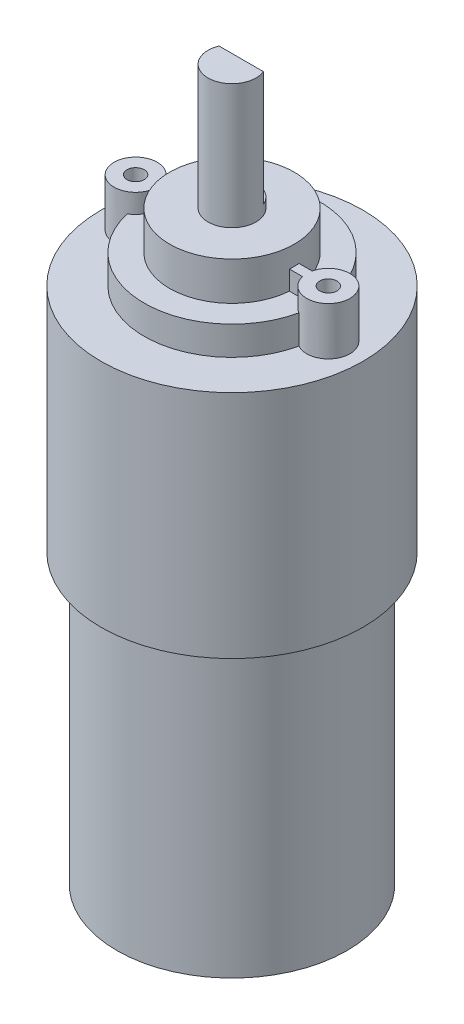
ISO-10303-21;
HEADER;
FILE_DESCRIPTION(('STEP AP214'),'2;1');
FILE_NAME('part.step','',(''),(''),'','','');
FILE_SCHEMA(('AUTOMOTIVE_DESIGN { 1 0 10303 214 1 1 1 1 }'));
ENDSEC;
DATA;
#1=APPLICATION_CONTEXT('core data for automotive mechanical design processes');
#2=APPLICATION_PROTOCOL_DEFINITION('international standard','automotive_design',2000,#1);
#3=PRODUCT_CONTEXT('',#1,'mechanical');
#4=PRODUCT('Part','Part','',(#3));
#5=PRODUCT_RELATED_PRODUCT_CATEGORY('part','',(#4));
#6=PRODUCT_DEFINITION_FORMATION('','',#4);
#7=PRODUCT_DEFINITION_CONTEXT('part definition',#1,'design');
#8=PRODUCT_DEFINITION('design','',#6,#7);
#9=PRODUCT_DEFINITION_SHAPE('','',#8);
#10=(LENGTH_UNIT() NAMED_UNIT(*) SI_UNIT(.MILLI.,.METRE.));
#11=(NAMED_UNIT(*) PLANE_ANGLE_UNIT() SI_UNIT($,.RADIAN.));
#12=(NAMED_UNIT(*) SI_UNIT($,.STERADIAN.) SOLID_ANGLE_UNIT());
#13=UNCERTAINTY_MEASURE_WITH_UNIT(LENGTH_MEASURE(1.E-05),#10,'distance_accuracy_value','');
#14=(GEOMETRIC_REPRESENTATION_CONTEXT(3) GLOBAL_UNCERTAINTY_ASSIGNED_CONTEXT((#13)) GLOBAL_UNIT_ASSIGNED_CONTEXT((#10,
#11,#12)) REPRESENTATION_CONTEXT('',''));
#15=CARTESIAN_POINT('',(0.,0.,0.));
#16=DIRECTION('',(0.,0.,1.));
#17=DIRECTION('',(1.,0.,0.));
#18=AXIS2_PLACEMENT_3D('',#15,#16,#17);
#19=CARTESIAN_POINT('',(0.,26.5,0.));
#20=DIRECTION('',(0.,1.,0.));
#21=DIRECTION('',(0.,0.,1.));
#22=AXIS2_PLACEMENT_3D('',#19,#20,#21);
#23=PLANE('',#22);
#24=DIRECTION('',(1.,0.,0.));
#25=VECTOR('',#24,1.);
#26=CARTESIAN_POINT('',(0.,26.5,0.500000000000004));
#27=LINE('',#26,#25);
#28=CARTESIAN_POINT('',(6.48074069840786,26.5,0.500000000000004));
#29=VERTEX_POINT('',#28);
#30=CARTESIAN_POINT('',(7.84625890315197,26.5,0.500000000000004));
#31=VERTEX_POINT('',#30);
#32=EDGE_CURVE('E167',#29,#31,#27,.T.);
#33=ORIENTED_EDGE('',*,*,#32,.F.);
#34=CARTESIAN_POINT('',(0.,26.5,0.));
#35=DIRECTION('',(0.,1.,0.));
#36=DIRECTION('',(0.,0.,1.));
#37=AXIS2_PLACEMENT_3D('',#34,#35,#36);
#38=CIRCLE('',#37,6.5);
#39=CARTESIAN_POINT('',(-6.48074069840786,26.5,0.500000000000004));
#40=VERTEX_POINT('',#39);
#41=EDGE_CURVE('E284',#40,#29,#38,.T.);
#42=ORIENTED_EDGE('',*,*,#41,.F.);
#43=CARTESIAN_POINT('',(-7.84625890315197,26.5,0.500000000000004));
#44=VERTEX_POINT('',#43);
#45=EDGE_CURVE('E310',#44,#40,#27,.T.);
#46=ORIENTED_EDGE('',*,*,#45,.F.);
#47=CARTESIAN_POINT('',(-10.04,26.5,0.));
#48=DIRECTION('',(0.,1.,0.));
#49=DIRECTION('',(0.,0.,1.));
#50=AXIS2_PLACEMENT_3D('',#47,#48,#49);
#51=CIRCLE('',#50,2.25);
#52=CARTESIAN_POINT('',(-8.93733067729084,26.5,1.96128028714819));
#53=VERTEX_POINT('',#52);
#54=EDGE_CURVE('E223',#44,#53,#51,.F.);
#55=ORIENTED_EDGE('',*,*,#54,.T.);
#56=CARTESIAN_POINT('',(0.,26.5,0.));
#57=DIRECTION('',(0.,1.,0.));
#58=DIRECTION('',(0.,0.,1.));
#59=AXIS2_PLACEMENT_3D('',#56,#57,#58);
#60=CIRCLE('',#59,9.15);
#61=CARTESIAN_POINT('',(8.93733067729083,26.5,1.9612802871482));
#62=VERTEX_POINT('',#61);
#63=EDGE_CURVE('E279',#53,#62,#60,.T.);
#64=ORIENTED_EDGE('',*,*,#63,.T.);
#65=CARTESIAN_POINT('',(10.04,26.5,0.));
#66=DIRECTION('',(0.,1.,0.));
#67=DIRECTION('',(0.,0.,1.));
#68=AXIS2_PLACEMENT_3D('',#65,#66,#67);
#69=CIRCLE('',#68,2.25);
#70=EDGE_CURVE('E238',#31,#62,#69,.T.);
#71=ORIENTED_EDGE('',*,*,#70,.F.);
#72=EDGE_LOOP('',(#33,#42,#46,#55,#64,#71));
#73=FACE_BOUND('',#72,.T.);
#74=ADVANCED_FACE('F40',(#73),#23,.T.);
#75=CARTESIAN_POINT('',(8.93733067729083,26.5,-1.9612802871482));
#76=VERTEX_POINT('',#75);
#77=CARTESIAN_POINT('',(7.84625890315197,26.5,-0.499999999999999));
#78=VERTEX_POINT('',#77);
#79=EDGE_CURVE('E241',#76,#78,#69,.T.);
#80=ORIENTED_EDGE('',*,*,#79,.F.);
#81=CARTESIAN_POINT('',(-8.93733067729083,26.5,-1.9612802871482));
#82=VERTEX_POINT('',#81);
#83=EDGE_CURVE('E332',#76,#82,#60,.T.);
#84=ORIENTED_EDGE('',*,*,#83,.T.);
#85=CARTESIAN_POINT('',(-7.84625890315197,26.5,-0.499999999999999));
#86=VERTEX_POINT('',#85);
#87=EDGE_CURVE('E219',#82,#86,#51,.F.);
#88=ORIENTED_EDGE('',*,*,#87,.T.);
#89=DIRECTION('',(1.,0.,0.));
#90=VECTOR('',#89,1.);
#91=CARTESIAN_POINT('',(0.,26.5,-0.499999999999999));
#92=LINE('',#91,#90);
#93=CARTESIAN_POINT('',(-6.48074069840786,26.5,-0.499999999999999));
#94=VERTEX_POINT('',#93);
#95=EDGE_CURVE('E308',#86,#94,#92,.T.);
#96=ORIENTED_EDGE('',*,*,#95,.T.);
#97=CARTESIAN_POINT('',(6.48074069840786,26.5,-0.499999999999999));
#98=VERTEX_POINT('',#97);
#99=EDGE_CURVE('E286',#98,#94,#38,.T.);
#100=ORIENTED_EDGE('',*,*,#99,.F.);
#101=EDGE_CURVE('E311',#98,#78,#92,.T.);
#102=ORIENTED_EDGE('',*,*,#101,.T.);
#103=EDGE_LOOP('',(#80,#84,#88,#96,#100,#102));
#104=FACE_BOUND('',#103,.T.);
#105=ADVANCED_FACE('F318',(#104),#23,.T.);
#106=CARTESIAN_POINT('',(0.,65.6871565633395,0.));
#107=DIRECTION('',(0.,1.,0.));
#108=DIRECTION('',(0.,0.,1.));
#109=AXIS2_PLACEMENT_3D('',#106,#107,#108);
#110=CYLINDRICAL_SURFACE('',#109,9.15);
#111=DIRECTION('',(0.,-1.,0.));
#112=VECTOR('',#111,1.);
#113=CARTESIAN_POINT('',(8.93733067729083,25.,-1.9612802871482));
#114=LINE('',#113,#112);
#115=CARTESIAN_POINT('',(8.93733067729083,23.5,-1.9612802871482));
#116=VERTEX_POINT('',#115);
#117=EDGE_CURVE('E240',#116,#76,#114,.F.);
#118=ORIENTED_EDGE('',*,*,#117,.F.);
#119=CARTESIAN_POINT('',(0.,23.5,0.));
#120=DIRECTION('',(0.,1.,0.));
#121=DIRECTION('',(0.,0.,1.));
#122=AXIS2_PLACEMENT_3D('',#119,#120,#121);
#123=CIRCLE('',#122,9.15);
#124=CARTESIAN_POINT('',(-8.93733067729083,23.5,-1.9612802871482));
#125=VERTEX_POINT('',#124);
#126=EDGE_CURVE('E339',#116,#125,#123,.T.);
#127=ORIENTED_EDGE('',*,*,#126,.T.);
#128=DIRECTION('',(0.,-1.,0.));
#129=VECTOR('',#128,1.);
#130=CARTESIAN_POINT('',(-8.93733067729083,25.,-1.9612802871482));
#131=LINE('',#130,#129);
#132=EDGE_CURVE('E216',#125,#82,#131,.F.);
#133=ORIENTED_EDGE('',*,*,#132,.T.);
#134=ORIENTED_EDGE('',*,*,#83,.F.);
#135=EDGE_LOOP('',(#118,#127,#133,#134));
#136=FACE_BOUND('',#135,.T.);
#137=ADVANCED_FACE('F338',(#136),#110,.T.);
#138=DIRECTION('',(0.,-1.,0.));
#139=VECTOR('',#138,1.);
#140=CARTESIAN_POINT('',(8.93733067729083,25.,1.9612802871482));
#141=LINE('',#140,#139);
#142=CARTESIAN_POINT('',(8.93733067729083,23.5,1.9612802871482));
#143=VERTEX_POINT('',#142);
#144=EDGE_CURVE('E235',#62,#143,#141,.T.);
#145=ORIENTED_EDGE('',*,*,#144,.F.);
#146=ORIENTED_EDGE('',*,*,#63,.F.);
#147=DIRECTION('',(0.,-1.,0.));
#148=VECTOR('',#147,1.);
#149=CARTESIAN_POINT('',(-8.93733067729083,25.,1.9612802871482));
#150=LINE('',#149,#148);
#151=CARTESIAN_POINT('',(-8.93733067729083,23.5,1.9612802871482));
#152=VERTEX_POINT('',#151);
#153=EDGE_CURVE('E222',#53,#152,#150,.T.);
#154=ORIENTED_EDGE('',*,*,#153,.T.);
#155=EDGE_CURVE('E274',#152,#143,#123,.T.);
#156=ORIENTED_EDGE('',*,*,#155,.T.);
#157=EDGE_LOOP('',(#145,#146,#154,#156));
#158=FACE_BOUND('',#157,.T.);
#159=ADVANCED_FACE('F378',(#158),#110,.T.);
#160=CARTESIAN_POINT('',(0.,23.5,0.));
#161=DIRECTION('',(0.,1.,0.));
#162=DIRECTION('',(0.,0.,1.));
#163=AXIS2_PLACEMENT_3D('',#160,#161,#162);
#164=PLANE('',#163);
#165=CARTESIAN_POINT('',(0.,23.5,0.));
#166=DIRECTION('',(0.,1.,0.));
#167=DIRECTION('',(0.,0.,1.));
#168=AXIS2_PLACEMENT_3D('',#165,#166,#167);
#169=CIRCLE('',#168,13.65);
#170=CARTESIAN_POINT('',(0.,23.5,13.65));
#171=VERTEX_POINT('',#170);
#172=EDGE_CURVE('E271',#171,#171,#169,.T.);
#173=ORIENTED_EDGE('',*,*,#172,.T.);
#174=EDGE_LOOP('',(#173));
#175=FACE_BOUND('',#174,.T.);
#176=CARTESIAN_POINT('',(10.04,23.5,0.));
#177=DIRECTION('',(0.,1.,0.));
#178=DIRECTION('',(0.,0.,1.));
#179=AXIS2_PLACEMENT_3D('',#176,#177,#178);
#180=CIRCLE('',#179,2.25);
#181=EDGE_CURVE('E305',#143,#116,#180,.T.);
#182=ORIENTED_EDGE('',*,*,#181,.F.);
#183=ORIENTED_EDGE('',*,*,#155,.F.);
#184=CARTESIAN_POINT('',(-10.04,23.5,0.));
#185=DIRECTION('',(0.,1.,0.));
#186=DIRECTION('',(0.,0.,1.));
#187=AXIS2_PLACEMENT_3D('',#184,#185,#186);
#188=CIRCLE('',#187,2.25);
#189=EDGE_CURVE('E299',#152,#125,#188,.F.);
#190=ORIENTED_EDGE('',*,*,#189,.T.);
#191=ORIENTED_EDGE('',*,*,#126,.F.);
#192=EDGE_LOOP('',(#182,#183,#190,#191));
#193=FACE_BOUND('',#192,.T.);
#194=ADVANCED_FACE('F367',(#175,#193),#164,.T.);
#195=CARTESIAN_POINT('',(0.,43.5,0.));
#196=DIRECTION('',(0.,1.,0.));
#197=DIRECTION('',(0.,0.,1.));
#198=AXIS2_PLACEMENT_3D('',#195,#196,#197);
#199=PLANE('',#198);
#200=DIRECTION('',(1.,0.,0.));
#201=VECTOR('',#200,1.);
#202=CARTESIAN_POINT('',(0.,43.5,-0.96));
#203=LINE('',#202,#201);
#204=CARTESIAN_POINT('',(-2.30833273164854,43.5,-0.96));
#205=VERTEX_POINT('',#204);
#206=CARTESIAN_POINT('',(2.30833273164854,43.5,-0.96));
#207=VERTEX_POINT('',#206);
#208=EDGE_CURVE('E251',#205,#207,#203,.T.);
#209=ORIENTED_EDGE('',*,*,#208,.F.);
#210=CARTESIAN_POINT('',(0.,43.5,0.));
#211=DIRECTION('',(0.,1.,0.));
#212=DIRECTION('',(0.,0.,1.));
#213=AXIS2_PLACEMENT_3D('',#210,#211,#212);
#214=CIRCLE('',#213,2.5);
#215=EDGE_CURVE('E293',#205,#207,#214,.T.);
#216=ORIENTED_EDGE('',*,*,#215,.T.);
#217=EDGE_LOOP('',(#209,#216));
#218=FACE_BOUND('',#217,.T.);
#219=ADVANCED_FACE('F42',(#218),#199,.T.);
#220=CARTESIAN_POINT('',(0.,65.6871565633395,0.));
#221=DIRECTION('',(0.,1.,0.));
#222=DIRECTION('',(0.,0.,1.));
#223=AXIS2_PLACEMENT_3D('',#220,#221,#222);
#224=CYLINDRICAL_SURFACE('',#223,2.5);
#225=DIRECTION('',(0.,1.,0.));
#226=VECTOR('',#225,1.);
#227=CARTESIAN_POINT('',(2.30833273164854,31.5,-0.96));
#228=LINE('',#227,#226);
#229=CARTESIAN_POINT('',(2.30833273164854,31.5,-0.96));
#230=VERTEX_POINT('',#229);
#231=EDGE_CURVE('E258',#230,#207,#228,.T.);
#232=ORIENTED_EDGE('',*,*,#231,.T.);
#233=ORIENTED_EDGE('',*,*,#215,.F.);
#234=DIRECTION('',(0.,1.,0.));
#235=VECTOR('',#234,1.);
#236=CARTESIAN_POINT('',(-2.30833273164854,31.5,-0.96));
#237=LINE('',#236,#235);
#238=CARTESIAN_POINT('',(-2.30833273164854,31.5,-0.96));
#239=VERTEX_POINT('',#238);
#240=EDGE_CURVE('E256',#239,#205,#237,.T.);
#241=ORIENTED_EDGE('',*,*,#240,.F.);
#242=CARTESIAN_POINT('',(0.,31.5,0.));
#243=DIRECTION('',(0.,1.,0.));
#244=DIRECTION('',(0.,0.,1.));
#245=AXIS2_PLACEMENT_3D('',#242,#243,#244);
#246=CIRCLE('',#245,2.5);
#247=EDGE_CURVE('E252',#230,#239,#246,.T.);
#248=ORIENTED_EDGE('',*,*,#247,.F.);
#249=EDGE_LOOP('',(#232,#233,#241,#248));
#250=FACE_BOUND('',#249,.T.);
#251=CARTESIAN_POINT('',(0.,30.5,0.));
#252=DIRECTION('',(0.,1.,0.));
#253=DIRECTION('',(0.,0.,1.));
#254=AXIS2_PLACEMENT_3D('',#251,#252,#253);
#255=CIRCLE('',#254,2.5);
#256=CARTESIAN_POINT('',(0.,30.5,2.5));
#257=VERTEX_POINT('',#256);
#258=EDGE_CURVE('E290',#257,#257,#255,.T.);
#259=ORIENTED_EDGE('',*,*,#258,.T.);
#260=EDGE_LOOP('',(#259));
#261=FACE_BOUND('',#260,.T.);
#262=ADVANCED_FACE('F574',(#250,#261),#224,.T.);
#263=CARTESIAN_POINT('',(0.,30.5,0.));
#264=DIRECTION('',(0.,1.,0.));
#265=DIRECTION('',(0.,0.,1.));
#266=AXIS2_PLACEMENT_3D('',#263,#264,#265);
#267=PLANE('',#266);
#268=CARTESIAN_POINT('',(0.,30.5,0.));
#269=DIRECTION('',(0.,1.,0.));
#270=DIRECTION('',(0.,0.,1.));
#271=AXIS2_PLACEMENT_3D('',#268,#269,#270);
#272=CIRCLE('',#271,6.5);
#273=CARTESIAN_POINT('',(0.,30.5,6.5));
#274=VERTEX_POINT('',#273);
#275=EDGE_CURVE('E287',#274,#274,#272,.T.);
#276=ORIENTED_EDGE('',*,*,#275,.T.);
#277=EDGE_LOOP('',(#276));
#278=FACE_BOUND('',#277,.T.);
#279=ORIENTED_EDGE('',*,*,#258,.F.);
#280=EDGE_LOOP('',(#279));
#281=FACE_BOUND('',#280,.T.);
#282=ADVANCED_FACE('F518',(#278,#281),#267,.T.);
#283=CARTESIAN_POINT('',(0.,65.6871565633395,0.));
#284=DIRECTION('',(0.,1.,0.));
#285=DIRECTION('',(0.,0.,1.));
#286=AXIS2_PLACEMENT_3D('',#283,#284,#285);
#287=CYLINDRICAL_SURFACE('',#286,6.5);
#288=DIRECTION('',(0.,1.,0.));
#289=VECTOR('',#288,1.);
#290=CARTESIAN_POINT('',(-6.48074069840786,65.6871565633395,0.500000000000004));
#291=LINE('',#290,#289);
#292=CARTESIAN_POINT('',(-6.48074069840786,28.5,0.500000000000004));
#293=VERTEX_POINT('',#292);
#294=EDGE_CURVE('E249',#40,#293,#291,.T.);
#295=ORIENTED_EDGE('',*,*,#294,.F.);
#296=ORIENTED_EDGE('',*,*,#41,.T.);
#297=DIRECTION('',(0.,1.,0.));
#298=VECTOR('',#297,1.);
#299=CARTESIAN_POINT('',(6.48074069840786,65.6871565633395,0.500000000000004));
#300=LINE('',#299,#298);
#301=CARTESIAN_POINT('',(6.48074069840786,28.5,0.500000000000004));
#302=VERTEX_POINT('',#301);
#303=EDGE_CURVE('E55',#302,#29,#300,.F.);
#304=ORIENTED_EDGE('',*,*,#303,.F.);
#305=CARTESIAN_POINT('',(0.,28.5,0.));
#306=DIRECTION('',(0.,1.,0.));
#307=DIRECTION('',(0.,0.,1.));
#308=AXIS2_PLACEMENT_3D('',#305,#306,#307);
#309=CIRCLE('',#308,6.5);
#310=CARTESIAN_POINT('',(6.48074069840786,28.5,-0.499999999999999));
#311=VERTEX_POINT('',#310);
#312=EDGE_CURVE('E44',#311,#302,#309,.F.);
#313=ORIENTED_EDGE('',*,*,#312,.F.);
#314=DIRECTION('',(0.,1.,0.));
#315=VECTOR('',#314,1.);
#316=CARTESIAN_POINT('',(6.48074069840786,65.6871565633395,-0.499999999999999));
#317=LINE('',#316,#315);
#318=EDGE_CURVE('E243',#311,#98,#317,.F.);
#319=ORIENTED_EDGE('',*,*,#318,.T.);
#320=ORIENTED_EDGE('',*,*,#99,.T.);
#321=DIRECTION('',(0.,1.,0.));
#322=VECTOR('',#321,1.);
#323=CARTESIAN_POINT('',(-6.48074069840786,65.6871565633395,-0.499999999999999));
#324=LINE('',#323,#322);
#325=CARTESIAN_POINT('',(-6.48074069840786,28.5,-0.499999999999999));
#326=VERTEX_POINT('',#325);
#327=EDGE_CURVE('E245',#94,#326,#324,.T.);
#328=ORIENTED_EDGE('',*,*,#327,.T.);
#329=EDGE_CURVE('E11',#293,#326,#309,.F.);
#330=ORIENTED_EDGE('',*,*,#329,.F.);
#331=EDGE_LOOP('',(#295,#296,#304,#313,#319,#320,#328,#330));
#332=FACE_BOUND('',#331,.T.);
#333=ORIENTED_EDGE('',*,*,#275,.F.);
#334=EDGE_LOOP('',(#333));
#335=FACE_BOUND('',#334,.T.);
#336=ADVANCED_FACE('F325',(#332,#335),#287,.T.);
#337=CARTESIAN_POINT('',(0.,65.6871565633395,0.));
#338=DIRECTION('',(0.,1.,0.));
#339=DIRECTION('',(0.,0.,1.));
#340=AXIS2_PLACEMENT_3D('',#337,#338,#339);
#341=CYLINDRICAL_SURFACE('',#340,13.65);
#342=CARTESIAN_POINT('',(0.,-0.5,0.));
#343=DIRECTION('',(0.,1.,0.));
#344=DIRECTION('',(0.,0.,1.));
#345=AXIS2_PLACEMENT_3D('',#342,#343,#344);
#346=CIRCLE('',#345,13.65);
#347=CARTESIAN_POINT('',(0.,-0.5,13.65));
#348=VERTEX_POINT('',#347);
#349=EDGE_CURVE('E268',#348,#348,#346,.T.);
#350=ORIENTED_EDGE('',*,*,#349,.T.);
#351=EDGE_LOOP('',(#350));
#352=FACE_BOUND('',#351,.T.);
#353=ORIENTED_EDGE('',*,*,#172,.F.);
#354=EDGE_LOOP('',(#353));
#355=FACE_BOUND('',#354,.T.);
#356=ADVANCED_FACE('F517',(#352,#355),#341,.T.);
#357=CARTESIAN_POINT('',(0.,-0.5,0.));
#358=DIRECTION('',(0.,-1.,0.));
#359=DIRECTION('',(0.,0.,-1.));
#360=AXIS2_PLACEMENT_3D('',#357,#358,#359);
#361=PLANE('',#360);
#362=CARTESIAN_POINT('',(0.,-0.5,0.));
#363=DIRECTION('',(0.,1.,0.));
#364=DIRECTION('',(0.,0.,1.));
#365=AXIS2_PLACEMENT_3D('',#362,#363,#364);
#366=CIRCLE('',#365,12.);
#367=CARTESIAN_POINT('',(0.,-0.5,12.));
#368=VERTEX_POINT('',#367);
#369=EDGE_CURVE('E265',#368,#368,#366,.T.);
#370=ORIENTED_EDGE('',*,*,#369,.T.);
#371=EDGE_LOOP('',(#370));
#372=FACE_BOUND('',#371,.T.);
#373=ORIENTED_EDGE('',*,*,#349,.F.);
#374=EDGE_LOOP('',(#373));
#375=FACE_BOUND('',#374,.T.);
#376=ADVANCED_FACE('F603',(#372,#375),#361,.T.);
#377=CARTESIAN_POINT('',(0.,65.6871565633395,0.));
#378=DIRECTION('',(0.,1.,0.));
#379=DIRECTION('',(0.,0.,1.));
#380=AXIS2_PLACEMENT_3D('',#377,#378,#379);
#381=CYLINDRICAL_SURFACE('',#380,12.);
#382=CARTESIAN_POINT('',(0.,-30.5,0.));
#383=DIRECTION('',(0.,1.,0.));
#384=DIRECTION('',(0.,0.,1.));
#385=AXIS2_PLACEMENT_3D('',#382,#383,#384);
#386=CIRCLE('',#385,12.);
#387=CARTESIAN_POINT('',(0.,-30.5,12.));
#388=VERTEX_POINT('',#387);
#389=EDGE_CURVE('E261',#388,#388,#386,.T.);
#390=ORIENTED_EDGE('',*,*,#389,.T.);
#391=EDGE_LOOP('',(#390));
#392=FACE_BOUND('',#391,.T.);
#393=ORIENTED_EDGE('',*,*,#369,.F.);
#394=EDGE_LOOP('',(#393));
#395=FACE_BOUND('',#394,.T.);
#396=ADVANCED_FACE('F593',(#392,#395),#381,.T.);
#397=CARTESIAN_POINT('',(0.,-30.5,0.));
#398=DIRECTION('',(0.,-1.,0.));
#399=DIRECTION('',(0.,0.,-1.));
#400=AXIS2_PLACEMENT_3D('',#397,#398,#399);
#401=PLANE('',#400);
#402=ORIENTED_EDGE('',*,*,#389,.F.);
#403=EDGE_LOOP('',(#402));
#404=FACE_BOUND('',#403,.T.);
#405=ADVANCED_FACE('F566',(#404),#401,.T.);
#406=CARTESIAN_POINT('',(0.,31.5,-0.96));
#407=DIRECTION('',(0.,0.,1.));
#408=DIRECTION('',(1.,0.,0.));
#409=AXIS2_PLACEMENT_3D('',#406,#407,#408);
#410=PLANE('',#409);
#411=ORIENTED_EDGE('',*,*,#208,.T.);
#412=ORIENTED_EDGE('',*,*,#231,.F.);
#413=DIRECTION('',(1.,0.,0.));
#414=VECTOR('',#413,1.);
#415=CARTESIAN_POINT('',(0.,31.5,-0.96));
#416=LINE('',#415,#414);
#417=EDGE_CURVE('E254',#239,#230,#416,.T.);
#418=ORIENTED_EDGE('',*,*,#417,.F.);
#419=ORIENTED_EDGE('',*,*,#240,.T.);
#420=EDGE_LOOP('',(#411,#412,#418,#419));
#421=FACE_BOUND('',#420,.T.);
#422=ADVANCED_FACE('F556',(#421),#410,.F.);
#423=CARTESIAN_POINT('',(0.,31.5,0.));
#424=DIRECTION('',(0.,1.,0.));
#425=DIRECTION('',(0.,0.,1.));
#426=AXIS2_PLACEMENT_3D('',#423,#424,#425);
#427=PLANE('',#426);
#428=ORIENTED_EDGE('',*,*,#247,.T.);
#429=ORIENTED_EDGE('',*,*,#417,.T.);
#430=EDGE_LOOP('',(#428,#429));
#431=FACE_BOUND('',#430,.T.);
#432=ADVANCED_FACE('F507',(#431),#427,.T.);
#433=CARTESIAN_POINT('',(-10.04,28.5,0.));
#434=DIRECTION('',(0.,-1.,0.));
#435=DIRECTION('',(0.,0.,-1.));
#436=AXIS2_PLACEMENT_3D('',#433,#434,#435);
#437=CYLINDRICAL_SURFACE('',#436,2.25);
#438=ORIENTED_EDGE('',*,*,#54,.F.);
#439=DIRECTION('',(0.,-1.,0.));
#440=VECTOR('',#439,1.);
#441=CARTESIAN_POINT('',(-7.84625890315197,28.5,0.500000000000004));
#442=LINE('',#441,#440);
#443=CARTESIAN_POINT('',(-7.84625890315197,28.5,0.500000000000004));
#444=VERTEX_POINT('',#443);
#445=EDGE_CURVE('E201',#444,#44,#442,.T.);
#446=ORIENTED_EDGE('',*,*,#445,.F.);
#447=CARTESIAN_POINT('',(-10.04,28.5,0.));
#448=DIRECTION('',(0.,1.,0.));
#449=DIRECTION('',(0.,0.,1.));
#450=AXIS2_PLACEMENT_3D('',#447,#448,#449);
#451=CIRCLE('',#450,2.25);
#452=CARTESIAN_POINT('',(-7.84625890315197,28.5,-0.499999999999999));
#453=VERTEX_POINT('',#452);
#454=EDGE_CURVE('E192',#453,#444,#451,.T.);
#455=ORIENTED_EDGE('',*,*,#454,.F.);
#456=DIRECTION('',(0.,-1.,0.));
#457=VECTOR('',#456,1.);
#458=CARTESIAN_POINT('',(-7.84625890315197,28.5,-0.499999999999999));
#459=LINE('',#458,#457);
#460=EDGE_CURVE('E204',#453,#86,#459,.T.);
#461=ORIENTED_EDGE('',*,*,#460,.T.);
#462=ORIENTED_EDGE('',*,*,#87,.F.);
#463=ORIENTED_EDGE('',*,*,#132,.F.);
#464=ORIENTED_EDGE('',*,*,#189,.F.);
#465=ORIENTED_EDGE('',*,*,#153,.F.);
#466=EDGE_LOOP('',(#438,#446,#455,#461,#462,#463,#464,#465));
#467=FACE_BOUND('',#466,.T.);
#468=ADVANCED_FACE('F334',(#467),#437,.T.);
#469=CARTESIAN_POINT('',(0.,28.5,-0.499999999999999));
#470=DIRECTION('',(0.,0.,1.));
#471=DIRECTION('',(1.,0.,0.));
#472=AXIS2_PLACEMENT_3D('',#469,#470,#471);
#473=PLANE('',#472);
#474=ORIENTED_EDGE('',*,*,#327,.F.);
#475=ORIENTED_EDGE('',*,*,#95,.F.);
#476=ORIENTED_EDGE('',*,*,#460,.F.);
#477=DIRECTION('',(-1.,0.,0.));
#478=VECTOR('',#477,1.);
#479=CARTESIAN_POINT('',(0.,28.5,-0.499999999999999));
#480=LINE('',#479,#478);
#481=EDGE_CURVE('E187',#326,#453,#480,.T.);
#482=ORIENTED_EDGE('',*,*,#481,.F.);
#483=EDGE_LOOP('',(#474,#475,#476,#482));
#484=FACE_BOUND('',#483,.T.);
#485=ADVANCED_FACE('F330',(#484),#473,.F.);
#486=CARTESIAN_POINT('',(0.,28.5,0.500000000000004));
#487=DIRECTION('',(0.,0.,1.));
#488=DIRECTION('',(1.,0.,0.));
#489=AXIS2_PLACEMENT_3D('',#486,#487,#488);
#490=PLANE('',#489);
#491=ORIENTED_EDGE('',*,*,#45,.T.);
#492=ORIENTED_EDGE('',*,*,#294,.T.);
#493=DIRECTION('',(-1.,0.,0.));
#494=VECTOR('',#493,1.);
#495=CARTESIAN_POINT('',(0.,28.5,0.500000000000004));
#496=LINE('',#495,#494);
#497=EDGE_CURVE('E180',#293,#444,#496,.T.);
#498=ORIENTED_EDGE('',*,*,#497,.T.);
#499=ORIENTED_EDGE('',*,*,#445,.T.);
#500=EDGE_LOOP('',(#491,#492,#498,#499));
#501=FACE_BOUND('',#500,.T.);
#502=ADVANCED_FACE('F394',(#501),#490,.T.);
#503=CARTESIAN_POINT('',(-10.04,28.5,0.));
#504=DIRECTION('',(0.,-1.,0.));
#505=DIRECTION('',(0.,0.,-1.));
#506=AXIS2_PLACEMENT_3D('',#503,#504,#505);
#507=CYLINDRICAL_SURFACE('',#506,0.9);
#508=CARTESIAN_POINT('',(-10.04,28.5,0.));
#509=DIRECTION('',(0.,1.,0.));
#510=DIRECTION('',(0.,0.,1.));
#511=AXIS2_PLACEMENT_3D('',#508,#509,#510);
#512=CIRCLE('',#511,0.9);
#513=CARTESIAN_POINT('',(-10.04,28.5,0.900000000000001));
#514=VERTEX_POINT('',#513);
#515=EDGE_CURVE('E198',#514,#514,#512,.T.);
#516=ORIENTED_EDGE('',*,*,#515,.T.);
#517=EDGE_LOOP('',(#516));
#518=FACE_BOUND('',#517,.T.);
#519=CARTESIAN_POINT('',(-10.04,26.5,0.));
#520=DIRECTION('',(0.,1.,0.));
#521=DIRECTION('',(0.,0.,1.));
#522=AXIS2_PLACEMENT_3D('',#519,#520,#521);
#523=CIRCLE('',#522,0.9);
#524=CARTESIAN_POINT('',(-9.14910856573705,26.5,-0.12772021123107));
#525=VERTEX_POINT('',#524);
#526=CARTESIAN_POINT('',(-9.14910856573705,26.5,0.127720211231075));
#527=VERTEX_POINT('',#526);
#528=EDGE_CURVE('E210',#525,#527,#523,.F.);
#529=ORIENTED_EDGE('',*,*,#528,.T.);
#530=DIRECTION('',(0.,-1.,0.));
#531=VECTOR('',#530,1.);
#532=CARTESIAN_POINT('',(-9.14910856573705,26.,0.127720211231075));
#533=LINE('',#532,#531);
#534=CARTESIAN_POINT('',(-9.14910856573705,23.5,0.127720211231075));
#535=VERTEX_POINT('',#534);
#536=EDGE_CURVE('E213',#527,#535,#533,.T.);
#537=ORIENTED_EDGE('',*,*,#536,.T.);
#538=CARTESIAN_POINT('',(-10.04,23.5,0.));
#539=DIRECTION('',(0.,1.,0.));
#540=DIRECTION('',(0.,0.,1.));
#541=AXIS2_PLACEMENT_3D('',#538,#539,#540);
#542=CIRCLE('',#541,0.9);
#543=CARTESIAN_POINT('',(-9.14910856573705,23.5,-0.127720211231072));
#544=VERTEX_POINT('',#543);
#545=EDGE_CURVE('E296',#535,#544,#542,.F.);
#546=ORIENTED_EDGE('',*,*,#545,.T.);
#547=DIRECTION('',(0.,-1.,0.));
#548=VECTOR('',#547,1.);
#549=CARTESIAN_POINT('',(-9.14910856573705,26.,-0.127720211231072));
#550=LINE('',#549,#548);
#551=EDGE_CURVE('E171',#544,#525,#550,.F.);
#552=ORIENTED_EDGE('',*,*,#551,.T.);
#553=EDGE_LOOP('',(#529,#537,#546,#552));
#554=FACE_BOUND('',#553,.T.);
#555=ADVANCED_FACE('F350',(#518,#554),#507,.F.);
#556=CARTESIAN_POINT('',(0.,28.5,0.));
#557=DIRECTION('',(0.,1.,0.));
#558=DIRECTION('',(0.,0.,1.));
#559=AXIS2_PLACEMENT_3D('',#556,#557,#558);
#560=PLANE('',#559);
#561=ORIENTED_EDGE('',*,*,#515,.F.);
#562=EDGE_LOOP('',(#561));
#563=FACE_BOUND('',#562,.T.);
#564=ORIENTED_EDGE('',*,*,#497,.F.);
#565=ORIENTED_EDGE('',*,*,#329,.T.);
#566=ORIENTED_EDGE('',*,*,#481,.T.);
#567=ORIENTED_EDGE('',*,*,#454,.T.);
#568=EDGE_LOOP('',(#564,#565,#566,#567));
#569=FACE_BOUND('',#568,.T.);
#570=ADVANCED_FACE('F375',(#563,#569),#560,.T.);
#571=ORIENTED_EDGE('',*,*,#545,.F.);
#572=EDGE_CURVE('E277',#544,#535,#123,.T.);
#573=ORIENTED_EDGE('',*,*,#572,.F.);
#574=EDGE_LOOP('',(#571,#573));
#575=FACE_BOUND('',#574,.T.);
#576=ADVANCED_FACE('F368',(#575),#164,.T.);
#577=ORIENTED_EDGE('',*,*,#536,.F.);
#578=EDGE_CURVE('E282',#525,#527,#60,.T.);
#579=ORIENTED_EDGE('',*,*,#578,.F.);
#580=ORIENTED_EDGE('',*,*,#551,.F.);
#581=ORIENTED_EDGE('',*,*,#572,.T.);
#582=EDGE_LOOP('',(#577,#579,#580,#581));
#583=FACE_BOUND('',#582,.T.);
#584=ADVANCED_FACE('F345',(#583),#110,.T.);
#585=ORIENTED_EDGE('',*,*,#528,.F.);
#586=ORIENTED_EDGE('',*,*,#578,.T.);
#587=EDGE_LOOP('',(#585,#586));
#588=FACE_BOUND('',#587,.T.);
#589=ADVANCED_FACE('F352',(#588),#23,.T.);
#590=CARTESIAN_POINT('',(7.84625890315197,28.5,0.500000000000004));
#591=VERTEX_POINT('',#590);
#592=EDGE_CURVE('E166',#591,#302,#496,.T.);
#593=ORIENTED_EDGE('',*,*,#592,.T.);
#594=ORIENTED_EDGE('',*,*,#303,.T.);
#595=ORIENTED_EDGE('',*,*,#32,.T.);
#596=DIRECTION('',(0.,-1.,0.));
#597=VECTOR('',#596,1.);
#598=CARTESIAN_POINT('',(7.84625890315197,28.5,0.500000000000004));
#599=LINE('',#598,#597);
#600=EDGE_CURVE('E163',#591,#31,#599,.T.);
#601=ORIENTED_EDGE('',*,*,#600,.F.);
#602=EDGE_LOOP('',(#593,#594,#595,#601));
#603=FACE_BOUND('',#602,.T.);
#604=ADVANCED_FACE('F165',(#603),#490,.T.);
#605=CARTESIAN_POINT('',(10.04,28.5,0.));
#606=DIRECTION('',(0.,-1.,0.));
#607=DIRECTION('',(0.,0.,-1.));
#608=AXIS2_PLACEMENT_3D('',#605,#606,#607);
#609=CYLINDRICAL_SURFACE('',#608,2.25);
#610=ORIENTED_EDGE('',*,*,#117,.T.);
#611=ORIENTED_EDGE('',*,*,#79,.T.);
#612=DIRECTION('',(0.,-1.,0.));
#613=VECTOR('',#612,1.);
#614=CARTESIAN_POINT('',(7.84625890315197,28.5,-0.499999999999999));
#615=LINE('',#614,#613);
#616=CARTESIAN_POINT('',(7.84625890315197,28.5,-0.499999999999999));
#617=VERTEX_POINT('',#616);
#618=EDGE_CURVE('E172',#617,#78,#615,.T.);
#619=ORIENTED_EDGE('',*,*,#618,.F.);
#620=CARTESIAN_POINT('',(10.04,28.5,0.));
#621=DIRECTION('',(0.,1.,0.));
#622=DIRECTION('',(0.,0.,1.));
#623=AXIS2_PLACEMENT_3D('',#620,#621,#622);
#624=CIRCLE('',#623,2.25);
#625=EDGE_CURVE('E179',#617,#591,#624,.F.);
#626=ORIENTED_EDGE('',*,*,#625,.T.);
#627=ORIENTED_EDGE('',*,*,#600,.T.);
#628=ORIENTED_EDGE('',*,*,#70,.T.);
#629=ORIENTED_EDGE('',*,*,#144,.T.);
#630=ORIENTED_EDGE('',*,*,#181,.T.);
#631=EDGE_LOOP('',(#610,#611,#619,#626,#627,#628,#629,#630));
#632=FACE_BOUND('',#631,.T.);
#633=ADVANCED_FACE('F183',(#632),#609,.T.);
#634=ORIENTED_EDGE('',*,*,#318,.F.);
#635=EDGE_CURVE('E189',#617,#311,#480,.T.);
#636=ORIENTED_EDGE('',*,*,#635,.F.);
#637=ORIENTED_EDGE('',*,*,#618,.T.);
#638=ORIENTED_EDGE('',*,*,#101,.F.);
#639=EDGE_LOOP('',(#634,#636,#637,#638));
#640=FACE_BOUND('',#639,.T.);
#641=ADVANCED_FACE('F324',(#640),#473,.F.);
#642=CARTESIAN_POINT('',(10.04,28.5,0.));
#643=DIRECTION('',(0.,-1.,0.));
#644=DIRECTION('',(0.,0.,-1.));
#645=AXIS2_PLACEMENT_3D('',#642,#643,#644);
#646=CYLINDRICAL_SURFACE('',#645,0.9);
#647=DIRECTION('',(0.,-1.,0.));
#648=VECTOR('',#647,1.);
#649=CARTESIAN_POINT('',(9.14910856573705,26.,-0.127720211231072));
#650=LINE('',#649,#648);
#651=CARTESIAN_POINT('',(9.14910856573705,23.5,-0.127720211231072));
#652=VERTEX_POINT('',#651);
#653=CARTESIAN_POINT('',(9.14910856573705,26.5,-0.127720211231072));
#654=VERTEX_POINT('',#653);
#655=EDGE_CURVE('E232',#652,#654,#650,.F.);
#656=ORIENTED_EDGE('',*,*,#655,.F.);
#657=CARTESIAN_POINT('',(10.04,23.5,0.));
#658=DIRECTION('',(0.,1.,0.));
#659=DIRECTION('',(0.,0.,1.));
#660=AXIS2_PLACEMENT_3D('',#657,#658,#659);
#661=CIRCLE('',#660,0.9);
#662=CARTESIAN_POINT('',(9.14910856573705,23.5,0.127720211231075));
#663=VERTEX_POINT('',#662);
#664=EDGE_CURVE('E302',#663,#652,#661,.T.);
#665=ORIENTED_EDGE('',*,*,#664,.F.);
#666=DIRECTION('',(0.,-1.,0.));
#667=VECTOR('',#666,1.);
#668=CARTESIAN_POINT('',(9.14910856573705,26.,0.127720211231075));
#669=LINE('',#668,#667);
#670=CARTESIAN_POINT('',(9.14910856573705,26.5,0.127720211231075));
#671=VERTEX_POINT('',#670);
#672=EDGE_CURVE('E226',#671,#663,#669,.T.);
#673=ORIENTED_EDGE('',*,*,#672,.F.);
#674=CARTESIAN_POINT('',(10.04,26.5,0.));
#675=DIRECTION('',(0.,1.,0.));
#676=DIRECTION('',(0.,0.,1.));
#677=AXIS2_PLACEMENT_3D('',#674,#675,#676);
#678=CIRCLE('',#677,0.9);
#679=EDGE_CURVE('E229',#654,#671,#678,.T.);
#680=ORIENTED_EDGE('',*,*,#679,.F.);
#681=EDGE_LOOP('',(#656,#665,#673,#680));
#682=FACE_BOUND('',#681,.T.);
#683=CARTESIAN_POINT('',(10.04,28.5,0.));
#684=DIRECTION('',(0.,1.,0.));
#685=DIRECTION('',(0.,0.,1.));
#686=AXIS2_PLACEMENT_3D('',#683,#684,#685);
#687=CIRCLE('',#686,0.9);
#688=CARTESIAN_POINT('',(10.04,28.5,0.900000000000001));
#689=VERTEX_POINT('',#688);
#690=EDGE_CURVE('E195',#689,#689,#687,.F.);
#691=ORIENTED_EDGE('',*,*,#690,.F.);
#692=EDGE_LOOP('',(#691));
#693=FACE_BOUND('',#692,.T.);
#694=ADVANCED_FACE('F361',(#682,#693),#646,.F.);
#695=ORIENTED_EDGE('',*,*,#635,.T.);
#696=ORIENTED_EDGE('',*,*,#312,.T.);
#697=ORIENTED_EDGE('',*,*,#592,.F.);
#698=ORIENTED_EDGE('',*,*,#625,.F.);
#699=EDGE_LOOP('',(#695,#696,#697,#698));
#700=FACE_BOUND('',#699,.T.);
#701=ORIENTED_EDGE('',*,*,#690,.T.);
#702=EDGE_LOOP('',(#701));
#703=FACE_BOUND('',#702,.T.);
#704=ADVANCED_FACE('F177',(#700,#703),#560,.T.);
#705=EDGE_CURVE('E278',#663,#652,#123,.T.);
#706=ORIENTED_EDGE('',*,*,#705,.F.);
#707=ORIENTED_EDGE('',*,*,#664,.T.);
#708=EDGE_LOOP('',(#706,#707));
#709=FACE_BOUND('',#708,.T.);
#710=ADVANCED_FACE('F364',(#709),#164,.T.);
#711=ORIENTED_EDGE('',*,*,#705,.T.);
#712=ORIENTED_EDGE('',*,*,#655,.T.);
#713=EDGE_CURVE('E283',#671,#654,#60,.T.);
#714=ORIENTED_EDGE('',*,*,#713,.F.);
#715=ORIENTED_EDGE('',*,*,#672,.T.);
#716=EDGE_LOOP('',(#711,#712,#714,#715));
#717=FACE_BOUND('',#716,.T.);
#718=ADVANCED_FACE('F358',(#717),#110,.T.);
#719=ORIENTED_EDGE('',*,*,#713,.T.);
#720=ORIENTED_EDGE('',*,*,#679,.T.);
#721=EDGE_LOOP('',(#719,#720));
#722=FACE_BOUND('',#721,.T.);
#723=ADVANCED_FACE('F356',(#722),#23,.T.);
#724=CLOSED_SHELL('',(#74,#105,#137,#159,#194,#219,#262,#282,#336,#356,#376,#396,#405,#422,#432,
#468,#485,#502,#555,#570,#576,#584,#589,#604,#633,#641,#694,#704,#710,#718,#723));
#725=MANIFOLD_SOLID_BREP('B2',#724);
#726=ADVANCED_BREP_SHAPE_REPRESENTATION('',(#18,#725),#14);
#727=SHAPE_DEFINITION_REPRESENTATION(#9,#726);
ENDSEC;
END-ISO-10303-21;
